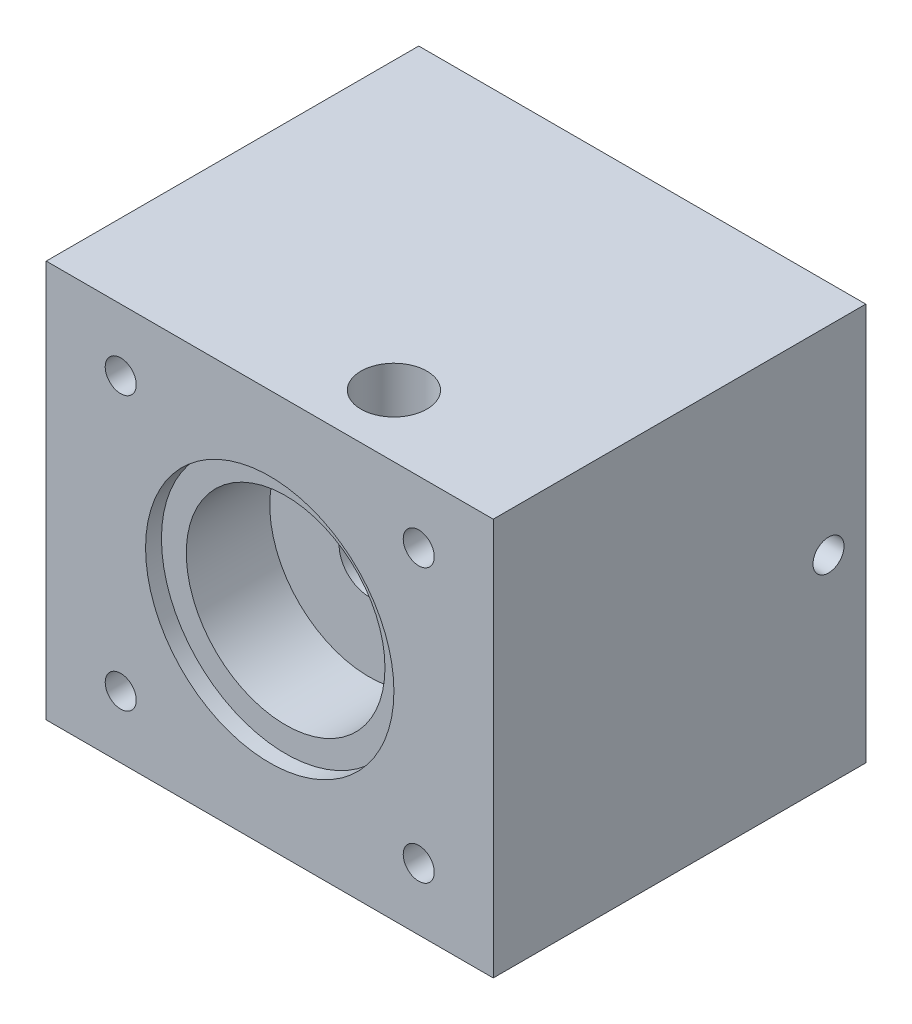
ISO-10303-21;
HEADER;
FILE_DESCRIPTION(('STEP AP214'),'2;1');
FILE_NAME('part.step','',(''),(''),'','','');
FILE_SCHEMA(('AUTOMOTIVE_DESIGN { 1 0 10303 214 1 1 1 1 }'));
ENDSEC;
DATA;
#1=APPLICATION_CONTEXT('core data for automotive mechanical design processes');
#2=APPLICATION_PROTOCOL_DEFINITION('international standard','automotive_design',2000,#1);
#3=PRODUCT_CONTEXT('',#1,'mechanical');
#4=PRODUCT('Part','Part','',(#3));
#5=PRODUCT_RELATED_PRODUCT_CATEGORY('part','',(#4));
#6=PRODUCT_DEFINITION_FORMATION('','',#4);
#7=PRODUCT_DEFINITION_CONTEXT('part definition',#1,'design');
#8=PRODUCT_DEFINITION('design','',#6,#7);
#9=PRODUCT_DEFINITION_SHAPE('','',#8);
#10=(LENGTH_UNIT() NAMED_UNIT(*) SI_UNIT(.MILLI.,.METRE.));
#11=(NAMED_UNIT(*) PLANE_ANGLE_UNIT() SI_UNIT($,.RADIAN.));
#12=(NAMED_UNIT(*) SI_UNIT($,.STERADIAN.) SOLID_ANGLE_UNIT());
#13=UNCERTAINTY_MEASURE_WITH_UNIT(LENGTH_MEASURE(1.E-05),#10,'distance_accuracy_value','');
#14=(GEOMETRIC_REPRESENTATION_CONTEXT(3) GLOBAL_UNCERTAINTY_ASSIGNED_CONTEXT((#13)) GLOBAL_UNIT_ASSIGNED_CONTEXT((#10,
#11,#12)) REPRESENTATION_CONTEXT('',''));
#15=CARTESIAN_POINT('',(0.,0.,0.));
#16=DIRECTION('',(0.,0.,1.));
#17=DIRECTION('',(1.,0.,0.));
#18=AXIS2_PLACEMENT_3D('',#15,#16,#17);
#19=CARTESIAN_POINT('',(47.625,25.4,6.35));
#20=DIRECTION('',(0.,0.,-1.));
#21=DIRECTION('',(-1.,0.,0.));
#22=AXIS2_PLACEMENT_3D('',#19,#20,#21);
#23=CYLINDRICAL_SURFACE('',#22,1.98501);
#24=CARTESIAN_POINT('',(47.625,25.4,0.));
#25=DIRECTION('',(0.,0.,-1.));
#26=DIRECTION('',(-1.,0.,0.));
#27=AXIS2_PLACEMENT_3D('',#24,#25,#26);
#28=CIRCLE('',#27,1.98501);
#29=CARTESIAN_POINT('',(45.63999,25.4,0.));
#30=VERTEX_POINT('',#29);
#31=EDGE_CURVE('E201',#30,#30,#28,.T.);
#32=ORIENTED_EDGE('',*,*,#31,.T.);
#33=EDGE_LOOP('',(#32));
#34=FACE_BOUND('',#33,.T.);
#35=DIRECTION('',(0.,0.,-1.));
#36=VECTOR('',#35,1.);
#37=CARTESIAN_POINT('',(46.0375,24.2083169674364,6.35));
#38=LINE('',#37,#36);
#39=CARTESIAN_POINT('',(46.0375,24.2083169674364,3.175));
#40=VERTEX_POINT('',#39);
#41=CARTESIAN_POINT('',(46.0375,24.2083169674364,6.35));
#42=VERTEX_POINT('',#41);
#43=EDGE_CURVE('E54',#40,#42,#38,.F.);
#44=ORIENTED_EDGE('',*,*,#43,.F.);
#45=CARTESIAN_POINT('',(47.625,25.4,4.7625));
#46=DIRECTION('',(0.707106781186547,0.,-0.707106781186547));
#47=DIRECTION('',(-0.707106781186547,0.,-0.707106781186547));
#48=AXIS2_PLACEMENT_3D('',#45,#46,#47);
#49=ELLIPSE('',#48,2.80722806344622,1.98501);
#50=CARTESIAN_POINT('',(47.625,23.41499,4.7625));
#51=VERTEX_POINT('',#50);
#52=EDGE_CURVE('E122',#40,#51,#49,.F.);
#53=ORIENTED_EDGE('',*,*,#52,.T.);
#54=CARTESIAN_POINT('',(47.625,25.4,4.7625));
#55=DIRECTION('',(-0.707106781186547,0.,-0.707106781186547));
#56=DIRECTION('',(0.707106781186547,0.,-0.707106781186547));
#57=AXIS2_PLACEMENT_3D('',#54,#55,#56);
#58=ELLIPSE('',#57,2.80722806344622,1.98501);
#59=CARTESIAN_POINT('',(47.625,27.38501,4.7625));
#60=VERTEX_POINT('',#59);
#61=EDGE_CURVE('E150',#51,#60,#58,.F.);
#62=ORIENTED_EDGE('',*,*,#61,.T.);
#63=CARTESIAN_POINT('',(46.0375,26.5916830325636,3.175));
#64=VERTEX_POINT('',#63);
#65=EDGE_CURVE('E134',#60,#64,#49,.F.);
#66=ORIENTED_EDGE('',*,*,#65,.T.);
#67=DIRECTION('',(0.,0.,-1.));
#68=VECTOR('',#67,1.);
#69=CARTESIAN_POINT('',(46.0375,26.5916830325636,6.35));
#70=LINE('',#69,#68);
#71=CARTESIAN_POINT('',(46.0375,26.5916830325636,6.35));
#72=VERTEX_POINT('',#71);
#73=EDGE_CURVE('E143',#72,#64,#70,.T.);
#74=ORIENTED_EDGE('',*,*,#73,.F.);
#75=CARTESIAN_POINT('',(47.625,25.4,6.35));
#76=DIRECTION('',(0.,0.,-1.));
#77=DIRECTION('',(-1.,0.,0.));
#78=AXIS2_PLACEMENT_3D('',#75,#76,#77);
#79=CIRCLE('',#78,1.98501);
#80=EDGE_CURVE('E141',#42,#72,#79,.T.);
#81=ORIENTED_EDGE('',*,*,#80,.F.);
#82=EDGE_LOOP('',(#44,#53,#62,#66,#74,#81));
#83=FACE_BOUND('',#82,.T.);
#84=ADVANCED_FACE('F33',(#34,#83),#23,.F.);
#85=CARTESIAN_POINT('',(47.625,25.4,6.35));
#86=DIRECTION('',(0.,0.,-1.));
#87=DIRECTION('',(-1.,0.,0.));
#88=AXIS2_PLACEMENT_3D('',#85,#86,#87);
#89=PLANE('',#88);
#90=ORIENTED_EDGE('',*,*,#80,.T.);
#91=DIRECTION('',(0.,-1.,0.));
#92=VECTOR('',#91,1.);
#93=CARTESIAN_POINT('',(46.0375,25.4,6.35));
#94=LINE('',#93,#92);
#95=EDGE_CURVE('E314',#72,#42,#94,.T.);
#96=ORIENTED_EDGE('',*,*,#95,.T.);
#97=EDGE_LOOP('',(#90,#96));
#98=FACE_BOUND('',#97,.T.);
#99=ADVANCED_FACE('F272',(#98),#89,.T.);
#100=CARTESIAN_POINT('',(9.525,25.4,6.35));
#101=DIRECTION('',(0.,0.,-1.));
#102=DIRECTION('',(-1.,0.,0.));
#103=AXIS2_PLACEMENT_3D('',#100,#101,#102);
#104=CYLINDRICAL_SURFACE('',#103,1.98501);
#105=CARTESIAN_POINT('',(9.525,25.4,0.));
#106=DIRECTION('',(0.,0.,-1.));
#107=DIRECTION('',(-1.,0.,0.));
#108=AXIS2_PLACEMENT_3D('',#105,#106,#107);
#109=CIRCLE('',#108,1.98501);
#110=CARTESIAN_POINT('',(7.53999,25.4,0.));
#111=VERTEX_POINT('',#110);
#112=EDGE_CURVE('E210',#111,#111,#109,.T.);
#113=ORIENTED_EDGE('',*,*,#112,.T.);
#114=EDGE_LOOP('',(#113));
#115=FACE_BOUND('',#114,.T.);
#116=DIRECTION('',(0.,0.,-1.));
#117=VECTOR('',#116,1.);
#118=CARTESIAN_POINT('',(11.1125,26.5916830325636,6.35));
#119=LINE('',#118,#117);
#120=CARTESIAN_POINT('',(11.1125,26.5916830325636,3.175));
#121=VERTEX_POINT('',#120);
#122=CARTESIAN_POINT('',(11.1125,26.5916830325636,6.35));
#123=VERTEX_POINT('',#122);
#124=EDGE_CURVE('E162',#121,#123,#119,.F.);
#125=ORIENTED_EDGE('',*,*,#124,.F.);
#126=CARTESIAN_POINT('',(9.525,25.4,4.7625));
#127=DIRECTION('',(-0.707106781186547,0.,-0.707106781186547));
#128=DIRECTION('',(0.707106781186547,0.,-0.707106781186547));
#129=AXIS2_PLACEMENT_3D('',#126,#127,#128);
#130=ELLIPSE('',#129,2.80722806344622,1.98501);
#131=CARTESIAN_POINT('',(9.525,27.38501,4.7625));
#132=VERTEX_POINT('',#131);
#133=EDGE_CURVE('E171',#121,#132,#130,.F.);
#134=ORIENTED_EDGE('',*,*,#133,.T.);
#135=CARTESIAN_POINT('',(9.525,25.4,4.7625));
#136=DIRECTION('',(0.707106781186547,0.,-0.707106781186547));
#137=DIRECTION('',(-0.707106781186547,0.,-0.707106781186547));
#138=AXIS2_PLACEMENT_3D('',#135,#136,#137);
#139=ELLIPSE('',#138,2.80722806344622,1.98501);
#140=CARTESIAN_POINT('',(9.525,23.41499,4.7625));
#141=VERTEX_POINT('',#140);
#142=EDGE_CURVE('E176',#132,#141,#139,.F.);
#143=ORIENTED_EDGE('',*,*,#142,.T.);
#144=CARTESIAN_POINT('',(11.1125,24.2083169674364,3.175));
#145=VERTEX_POINT('',#144);
#146=EDGE_CURVE('E175',#141,#145,#130,.F.);
#147=ORIENTED_EDGE('',*,*,#146,.T.);
#148=DIRECTION('',(0.,0.,-1.));
#149=VECTOR('',#148,1.);
#150=CARTESIAN_POINT('',(11.1125,24.2083169674364,6.35));
#151=LINE('',#150,#149);
#152=CARTESIAN_POINT('',(11.1125,24.2083169674364,6.35));
#153=VERTEX_POINT('',#152);
#154=EDGE_CURVE('E156',#153,#145,#151,.T.);
#155=ORIENTED_EDGE('',*,*,#154,.F.);
#156=CARTESIAN_POINT('',(9.525,25.4,6.35));
#157=DIRECTION('',(0.,0.,-1.));
#158=DIRECTION('',(-1.,0.,0.));
#159=AXIS2_PLACEMENT_3D('',#156,#157,#158);
#160=CIRCLE('',#159,1.98501);
#161=EDGE_CURVE('E208',#123,#153,#160,.T.);
#162=ORIENTED_EDGE('',*,*,#161,.F.);
#163=EDGE_LOOP('',(#125,#134,#143,#147,#155,#162));
#164=FACE_BOUND('',#163,.T.);
#165=ADVANCED_FACE('F280',(#115,#164),#104,.F.);
#166=CARTESIAN_POINT('',(9.525,25.4,6.35));
#167=DIRECTION('',(0.,0.,-1.));
#168=DIRECTION('',(-1.,0.,0.));
#169=AXIS2_PLACEMENT_3D('',#166,#167,#168);
#170=PLANE('',#169);
#171=ORIENTED_EDGE('',*,*,#161,.T.);
#172=DIRECTION('',(0.,1.,0.));
#173=VECTOR('',#172,1.);
#174=CARTESIAN_POINT('',(11.1125,25.4,6.35));
#175=LINE('',#174,#173);
#176=EDGE_CURVE('E326',#153,#123,#175,.T.);
#177=ORIENTED_EDGE('',*,*,#176,.T.);
#178=EDGE_LOOP('',(#171,#177));
#179=FACE_BOUND('',#178,.T.);
#180=ADVANCED_FACE('F385',(#179),#170,.T.);
#181=CARTESIAN_POINT('',(28.575,25.4,0.));
#182=DIRECTION('',(0.,0.,1.));
#183=DIRECTION('',(1.,0.,0.));
#184=AXIS2_PLACEMENT_3D('',#181,#182,#183);
#185=CYLINDRICAL_SURFACE('',#184,3.8354);
#186=CARTESIAN_POINT('',(28.575,25.4,34.925));
#187=DIRECTION('',(0.,0.,1.));
#188=DIRECTION('',(1.,0.,0.));
#189=AXIS2_PLACEMENT_3D('',#186,#187,#188);
#190=CIRCLE('',#189,3.8354);
#191=CARTESIAN_POINT('',(32.4104,25.4,34.925));
#192=VERTEX_POINT('',#191);
#193=EDGE_CURVE('E336',#192,#192,#190,.F.);
#194=ORIENTED_EDGE('',*,*,#193,.F.);
#195=EDGE_LOOP('',(#194));
#196=FACE_BOUND('',#195,.T.);
#197=CARTESIAN_POINT('',(28.575,25.4,2.794));
#198=DIRECTION('',(0.,0.,-1.));
#199=DIRECTION('',(-1.,0.,0.));
#200=AXIS2_PLACEMENT_3D('',#197,#198,#199);
#201=CIRCLE('',#200,3.8354);
#202=CARTESIAN_POINT('',(24.7396,25.4,2.794));
#203=VERTEX_POINT('',#202);
#204=EDGE_CURVE('E222',#203,#203,#201,.F.);
#205=ORIENTED_EDGE('',*,*,#204,.F.);
#206=EDGE_LOOP('',(#205));
#207=FACE_BOUND('',#206,.T.);
#208=ADVANCED_FACE('F377',(#196,#207),#185,.F.);
#209=CARTESIAN_POINT('',(28.575,25.4,34.925));
#210=DIRECTION('',(0.,0.,1.));
#211=DIRECTION('',(1.,0.,0.));
#212=AXIS2_PLACEMENT_3D('',#209,#210,#211);
#213=CYLINDRICAL_SURFACE('',#212,12.7);
#214=CARTESIAN_POINT('',(36.5125,35.3139343224575,43.9039));
#215=CARTESIAN_POINT('',(36.6516280292797,35.2025417451199,43.903900216119));
#216=CARTESIAN_POINT('',(36.7884335575704,35.0881932089361,43.8970134166104));
#217=CARTESIAN_POINT('',(37.0564839618486,34.8544223142145,43.8708318174462));
#218=CARTESIAN_POINT('',(37.1877251363861,34.7349966809268,43.8515288923607));
#219=CARTESIAN_POINT('',(37.4444079135831,34.4914794970766,43.801710013297));
#220=CARTESIAN_POINT('',(37.5698288140301,34.3673737714213,43.7711570430975));
#221=CARTESIAN_POINT('',(37.8140013520869,34.1155964957841,43.7000171205012));
#222=CARTESIAN_POINT('',(37.9327534774568,33.987925207616,43.6594309031211));
#223=CARTESIAN_POINT('',(38.2153553843962,33.6714317843791,43.5489224861815));
#224=CARTESIAN_POINT('',(38.3754321929643,33.4809622714377,43.4740200894582));
#225=CARTESIAN_POINT('',(38.6809579166009,33.0954642206641,43.3077342367703));
#226=CARTESIAN_POINT('',(38.826398865194,32.9004332704012,43.2163418799004));
#227=CARTESIAN_POINT('',(39.1027270122318,32.5073703903988,43.0188086455895));
#228=CARTESIAN_POINT('',(39.2336046235855,32.3093365801831,42.9126581550273));
#229=CARTESIAN_POINT('',(39.4808179090983,31.9121268599586,42.686696194221));
#230=CARTESIAN_POINT('',(39.597159806597,31.7129514771693,42.5668906125893));
#231=CARTESIAN_POINT('',(39.7730564691428,31.3927267921,42.3628003725987));
#232=CARTESIAN_POINT('',(39.8371130738036,31.2713879909421,42.2827987331947));
#233=CARTESIAN_POINT('',(39.9598564826955,31.0296889115665,42.1173922257172));
#234=CARTESIAN_POINT('',(40.0185440078874,30.9093285039536,42.031988085705));
#235=CARTESIAN_POINT('',(40.1303508240528,30.6707845124965,41.8554656057517));
#236=CARTESIAN_POINT('',(40.1834847233439,30.5525959280981,41.7643633190012));
#237=CARTESIAN_POINT('',(40.2842006357529,30.3194222173144,41.5752993997106));
#238=CARTESIAN_POINT('',(40.3317851429677,30.2044356696445,41.4773408805318));
#239=CARTESIAN_POINT('',(40.4156779709564,29.9934336260044,41.285263116512));
#240=CARTESIAN_POINT('',(40.4526540186308,29.8968064044417,41.1921140989876));
#241=CARTESIAN_POINT('',(40.521651364214,29.7101495365032,40.9972525918994));
#242=CARTESIAN_POINT('',(40.5536655016631,29.6201295216489,40.8955280477802));
#243=CARTESIAN_POINT('',(40.6073202066154,29.4643584296364,40.697156502899));
#244=CARTESIAN_POINT('',(40.6297962744492,29.3969917057496,40.6020295852183));
#245=CARTESIAN_POINT('',(40.669134820026,29.2763257115478,40.4021360268526));
#246=CARTESIAN_POINT('',(40.6860177857001,29.2229752507717,40.2974064035603));
#247=CARTESIAN_POINT('',(40.7073148043534,29.1546934605108,40.1191519854232));
#248=CARTESIAN_POINT('',(40.7140307234782,29.1328556889138,40.0486014195256));
#249=CARTESIAN_POINT('',(40.7239150314796,29.1005614916139,39.9047234373582));
#250=CARTESIAN_POINT('',(40.7270896818643,29.0900849783737,39.8314011600789));
#251=CARTESIAN_POINT('',(40.7295481156763,29.0819811531365,39.6835986243642));
#252=CARTESIAN_POINT('',(40.7288131492894,29.0844157603649,39.6091144969057));
#253=CARTESIAN_POINT('',(40.7235011020894,29.101890623878,39.461763162896));
#254=CARTESIAN_POINT('',(40.7189192613793,29.1169464969422,39.3888980743548));
#255=CARTESIAN_POINT('',(40.7044393668785,29.1639689975235,39.2244015711825));
#256=CARTESIAN_POINT('',(40.6933300593205,29.1997419294353,39.1339929760712));
#257=CARTESIAN_POINT('',(40.6666038742856,29.2839485152508,38.959994732195));
#258=CARTESIAN_POINT('',(40.6509735749089,29.3324198270485,38.8764263525769));
#259=CARTESIAN_POINT('',(40.6164834328254,29.4367876655952,38.7169955379318));
#260=CARTESIAN_POINT('',(40.5976826478644,29.492544827845,38.6410267218405));
#261=CARTESIAN_POINT('',(40.557226742838,29.6095226952861,38.4941766032984));
#262=CARTESIAN_POINT('',(40.5355686531711,29.6707490629562,38.4233007139618));
#263=CARTESIAN_POINT('',(40.4897076601234,29.7970754052366,38.2856732615415));
#264=CARTESIAN_POINT('',(40.4654987837041,29.8621843095195,38.2189319872286));
#265=CARTESIAN_POINT('',(40.4147837164516,29.9950609932965,38.0890413274218));
#266=CARTESIAN_POINT('',(40.3882766872333,30.062829738146,38.0258932667947));
#267=CARTESIAN_POINT('',(40.3273545719437,30.2145781117548,37.8898429428732));
#268=CARTESIAN_POINT('',(40.2924426338466,30.2989929618863,37.817650311125));
#269=CARTESIAN_POINT('',(40.2195999864084,30.4697062824488,37.6771037372212));
#270=CARTESIAN_POINT('',(40.1816685696883,30.5560051908047,37.6087507010097));
#271=CARTESIAN_POINT('',(40.0634016398084,30.8169223719503,37.4086378565292));
#272=CARTESIAN_POINT('',(39.9786422875604,30.9934380968967,37.281931278089));
#273=CARTESIAN_POINT('',(39.7974563291191,31.3486441127071,37.0398733768858));
#274=CARTESIAN_POINT('',(39.7010119926956,31.5273373285824,36.9245398043098));
#275=CARTESIAN_POINT('',(39.496552616868,31.8847558679295,36.7048912942663));
#276=CARTESIAN_POINT('',(39.3885423798794,32.0634811475493,36.6005718189635));
#277=CARTESIAN_POINT('',(39.1475872387881,32.4403162025411,36.3916488769533));
#278=CARTESIAN_POINT('',(39.013203295277,32.6382703440604,36.2884154403964));
#279=CARTESIAN_POINT('',(38.7296309838936,33.0309991862636,36.0970097826879));
#280=CARTESIAN_POINT('',(38.5804375198685,33.2257727654372,36.0088427746967));
#281=CARTESIAN_POINT('',(38.2677255996594,33.6098865652802,35.8498057275719));
#282=CARTESIAN_POINT('',(38.1042487410666,33.7992405632951,35.7788875958791));
#283=CARTESIAN_POINT('',(37.7629907451034,34.1712267030886,35.6567301489407));
#284=CARTESIAN_POINT('',(37.5852193980655,34.353863322757,35.6054775012965));
#285=CARTESIAN_POINT('',(37.2847787009618,34.644231998832,35.540731275501));
#286=CARTESIAN_POINT('',(37.1661357462776,34.7546148796222,35.520283550394));
#287=CARTESIAN_POINT('',(36.9239826945106,34.971356356394,35.489452643209));
#288=CARTESIAN_POINT('',(36.8004739867477,35.0777160843481,35.4790666095796));
#289=CARTESIAN_POINT('',(36.5492788512389,35.2857194013401,35.4693889357973));
#290=CARTESIAN_POINT('',(36.4215960171114,35.3873668739754,35.4700879907907));
#291=CARTESIAN_POINT('',(36.1628016273912,35.5853713971943,35.4836303129242));
#292=CARTESIAN_POINT('',(36.0316905917018,35.681729243184,35.4964717488815));
#293=CARTESIAN_POINT('',(35.7895077401517,35.8527029971414,35.5320627855703));
#294=CARTESIAN_POINT('',(35.6787881187629,35.9282438184365,35.5527745734162));
#295=CARTESIAN_POINT('',(35.4565950401765,36.0747997815191,35.6038640304821));
#296=CARTESIAN_POINT('',(35.3451217381853,36.1458158254793,35.6342397655717));
#297=CARTESIAN_POINT('',(35.1223651587741,36.2829738482305,35.7051368878799));
#298=CARTESIAN_POINT('',(35.0110819072578,36.3491152074877,35.7456595618259));
#299=CARTESIAN_POINT('',(34.7899025172475,36.4761564842906,35.8371751796783));
#300=CARTESIAN_POINT('',(34.6800057092189,36.5370590214353,35.8881628470135));
#301=CARTESIAN_POINT('',(34.4619871979524,36.6538343721772,36.001226118655));
#302=CARTESIAN_POINT('',(34.3538848954616,36.7096662007686,36.0633817299956));
#303=CARTESIAN_POINT('',(34.141738655687,36.8155802498037,36.1984709475547));
#304=CARTESIAN_POINT('',(34.0376928575533,36.8656651275461,36.2713995365474));
#305=CARTESIAN_POINT('',(33.8350440852495,36.9600360008626,36.4278007937771));
#306=CARTESIAN_POINT('',(33.736440616976,37.0043225233659,36.5112725025449));
#307=CARTESIAN_POINT('',(33.5460895555223,37.0871315382786,36.6882796495823));
#308=CARTESIAN_POINT('',(33.4543410924513,37.1256547626665,36.7818138072531));
#309=CARTESIAN_POINT('',(33.2895949633974,37.1927745802662,36.9664108566707));
#310=CARTESIAN_POINT('',(33.2156694106689,37.2220078439681,37.0564171531216));
#311=CARTESIAN_POINT('',(33.0749999158131,37.2762656009115,37.2430625562811));
#312=CARTESIAN_POINT('',(33.0082554177487,37.3012904200438,37.3397011485857));
#313=CARTESIAN_POINT('',(32.8827136969183,37.3473040654859,37.5388870411854));
#314=CARTESIAN_POINT('',(32.8239147263029,37.368293779865,37.6414330348736));
#315=CARTESIAN_POINT('',(32.714897849552,37.4064392440577,37.8516713340458));
#316=CARTESIAN_POINT('',(32.6646798184165,37.4235950497216,37.9593635645345));
#317=CARTESIAN_POINT('',(32.5756713723503,37.4534941315025,38.1735083622554));
#318=CARTESIAN_POINT('',(32.5364326754282,37.4664161750814,38.2797500161551));
#319=CARTESIAN_POINT('',(32.4665454768009,37.4891366884586,38.4953881962008));
#320=CARTESIAN_POINT('',(32.4358998306687,37.4989341200594,38.6047857578047));
#321=CARTESIAN_POINT('',(32.3835152379402,37.5155258692787,38.8258655657066));
#322=CARTESIAN_POINT('',(32.3617724714165,37.522321474979,38.937546810511));
#323=CARTESIAN_POINT('',(32.3273678633033,37.5330153195431,39.1624788829047));
#324=CARTESIAN_POINT('',(32.3147093788445,37.5369124872975,39.2757302750043));
#325=CARTESIAN_POINT('',(32.2986488103976,37.5418495186437,39.5022786587906));
#326=CARTESIAN_POINT('',(32.2951927072028,37.5429060574655,39.6155714623306));
#327=CARTESIAN_POINT('',(32.2974125498334,37.5422257517196,39.8421010268997));
#328=CARTESIAN_POINT('',(32.3030918484061,37.5404878815874,39.9553377520895));
#329=CARTESIAN_POINT('',(32.3235343038471,37.5341915485419,40.1808669216259));
#330=CARTESIAN_POINT('',(32.338294098556,37.529634129596,40.2931596998879));
#331=CARTESIAN_POINT('',(32.3767688896967,37.5176300869064,40.516086688437));
#332=CARTESIAN_POINT('',(32.4004871831721,37.5101823994142,40.626720272477));
#333=CARTESIAN_POINT('',(32.4566631122776,37.4922933897126,40.8455033788965));
#334=CARTESIAN_POINT('',(32.4891210877791,37.4818519510803,40.9536528044938));
#335=CARTESIAN_POINT('',(32.5624874834829,37.4578369861771,41.1667333187739));
#336=CARTESIAN_POINT('',(32.6033990046338,37.4442623103505,41.2716632101923));
#337=CARTESIAN_POINT('',(32.6932566124252,37.4138340889848,41.4774750415785));
#338=CARTESIAN_POINT('',(32.7421991141611,37.3969820058103,41.5783587628024));
#339=CARTESIAN_POINT('',(32.8476732048711,37.3598240258848,41.7754591786119));
#340=CARTESIAN_POINT('',(32.9042075723365,37.3395168639048,41.8716741468808));
#341=CARTESIAN_POINT('',(33.0242711936005,37.2952961322718,42.0587075301506));
#342=CARTESIAN_POINT('',(33.0877973249669,37.2713841707263,42.1495283264434));
#343=CARTESIAN_POINT('',(33.2212200405322,37.2198040837601,42.3252455029314));
#344=CARTESIAN_POINT('',(33.2911189247586,37.1921346004124,42.410139724457));
#345=CARTESIAN_POINT('',(33.5092691160816,37.103313288391,42.6550367705017));
#346=CARTESIAN_POINT('',(33.666115265701,37.0362983496885,42.8054718299366));
#347=CARTESIAN_POINT('',(33.9988000422097,36.8850459757278,43.0796451406653));
#348=CARTESIAN_POINT('',(34.1749059741952,36.8005462686809,43.2029096296674));
#349=CARTESIAN_POINT('',(34.537234644099,36.6153088852494,43.4185626034665));
#350=CARTESIAN_POINT('',(34.7234624292525,36.5145630576082,43.5109355169709));
#351=CARTESIAN_POINT('',(35.1130544033728,36.2902666489104,43.6708505493183));
#352=CARTESIAN_POINT('',(35.3166903703547,36.1655993052855,43.7361393106794));
#353=CARTESIAN_POINT('',(35.7216380041273,35.9011431576919,43.8343015977017));
#354=CARTESIAN_POINT('',(35.9229511360437,35.7613645355274,43.8671968005539));
#355=CARTESIAN_POINT('',(36.1868536211121,35.5664402709638,43.8918324803748));
#356=CARTESIAN_POINT('',(36.2526349738597,35.5168536809217,43.8963930907255));
#357=CARTESIAN_POINT('',(36.3832762117168,35.4163664979118,43.9024258617216));
#358=CARTESIAN_POINT('',(36.4481366331874,35.3654667228839,43.9038999000191));
#359=CARTESIAN_POINT('',(36.5125,35.3139343224575,43.9039));
#360=B_SPLINE_CURVE_WITH_KNOTS('',3,(#214,#215,#216,#217,#218,#219,#220,#221,#222,#223,#224,
#225,#226,#227,#228,#229,#230,#231,#232,#233,#234,#235,#236,#237,#238,#239,#240,#241,#242,#243,
#244,#245,#246,#247,#248,#249,#250,#251,#252,#253,#254,#255,#256,#257,#258,#259,#260,#261,#262,
#263,#264,#265,#266,#267,#268,#269,#270,#271,#272,#273,#274,#275,#276,#277,#278,#279,#280,#281,
#282,#283,#284,#285,#286,#287,#288,#289,#290,#291,#292,#293,#294,#295,#296,#297,#298,#299,#300,
#301,#302,#303,#304,#305,#306,#307,#308,#309,#310,#311,#312,#313,#314,#315,#316,#317,#318,#319,
#320,#321,#322,#323,#324,#325,#326,#327,#328,#329,#330,#331,#332,#333,#334,#335,#336,#337,#338,
#339,#340,#341,#342,#343,#344,#345,#346,#347,#348,#349,#350,#351,#352,#353,#354,#355,#356,#357,
#358,#359),.UNSPECIFIED.,.T.,.F.,(4,2,2,2,2,2,2,2,2,2,2,2,2,2,2,2,2,2,2,2,2,2,2,2,2,2,2,2,2,2,2,
2,2,2,2,2,2,2,2,2,2,2,2,2,2,2,2,2,2,2,2,2,2,2,2,2,2,2,2,2,2,2,2,2,2,2,2,2,2,2,2,2,4),(0.,
0.534598788010329,1.06954778757262,1.6062729012978,2.14295870720543,2.92132340220757,
3.70010950454983,4.47940528854249,5.2583662720696,5.73469588474094,6.21096144164,
6.68594090765666,7.16070607130634,7.57801105837676,7.99591275489937,8.35124575638996,
8.70526237245001,8.92690927343523,9.14816364429593,9.37048006484701,9.59307197280898,
9.88498676789456,10.1777772530561,10.46561846535,10.7537612234802,11.0425943716319,
11.3315333354575,11.6806845934456,12.0299178898383,12.7288934271557,13.4289431608115,
14.1287033374001,14.9096137577094,15.6907938374219,16.4697702338526,17.248217578877,
17.7378547735369,18.2273531610702,18.7164406840835,19.2054544599563,19.6119426932115,
20.0183496235469,20.4248081162366,20.8310621690885,21.2403519351887,21.6494516830201,
22.058514227808,22.4675247746483,22.8273261704407,23.1870996913347,23.5467939403012,
23.9064829490908,24.2480497353069,24.58972989407,24.9312632953151,25.2729228466143,
25.6125723431587,25.9523465215459,26.2919949702362,26.6317685435291,26.9715553319439,
27.3114669836934,27.6512273148931,27.9911123331085,28.3308461742462,28.6707031198106,
29.349633397519,30.0396009113308,30.7299156896966,31.4696917783434,32.2089724849492,
32.4564389994397,32.7037549290074),.UNSPECIFIED.);
#361=CARTESIAN_POINT('',(36.5125,35.3139343224575,43.9039));
#362=VERTEX_POINT('',#361);
#363=EDGE_CURVE('E228',#362,#362,#360,.T.);
#364=ORIENTED_EDGE('',*,*,#363,.T.);
#365=EDGE_LOOP('',(#364));
#366=FACE_BOUND('',#365,.T.);
#367=CARTESIAN_POINT('',(28.575,25.4,34.925));
#368=DIRECTION('',(0.,0.,1.));
#369=DIRECTION('',(1.,0.,0.));
#370=AXIS2_PLACEMENT_3D('',#367,#368,#369);
#371=CIRCLE('',#370,12.7);
#372=CARTESIAN_POINT('',(41.275,25.4,34.925));
#373=VERTEX_POINT('',#372);
#374=EDGE_CURVE('E335',#373,#373,#371,.T.);
#375=ORIENTED_EDGE('',*,*,#374,.F.);
#376=EDGE_LOOP('',(#375));
#377=FACE_BOUND('',#376,.T.);
#378=CARTESIAN_POINT('',(28.575,25.4,45.593));
#379=DIRECTION('',(0.,0.,1.));
#380=DIRECTION('',(1.,0.,0.));
#381=AXIS2_PLACEMENT_3D('',#378,#379,#380);
#382=CIRCLE('',#381,12.7);
#383=CARTESIAN_POINT('',(41.275,25.4,45.593));
#384=VERTEX_POINT('',#383);
#385=EDGE_CURVE('E332',#384,#384,#382,.F.);
#386=ORIENTED_EDGE('',*,*,#385,.F.);
#387=EDGE_LOOP('',(#386));
#388=FACE_BOUND('',#387,.T.);
#389=ADVANCED_FACE('F239',(#366,#377,#388),#213,.F.);
#390=CARTESIAN_POINT('',(0.,0.,47.625));
#391=DIRECTION('',(1.,0.,0.));
#392=DIRECTION('',(0.,0.,-1.));
#393=AXIS2_PLACEMENT_3D('',#390,#391,#392);
#394=PLANE('',#393);
#395=CARTESIAN_POINT('',(0.,25.4,4.7625));
#396=DIRECTION('',(-1.,0.,0.));
#397=DIRECTION('',(0.,0.,1.));
#398=AXIS2_PLACEMENT_3D('',#395,#396,#397);
#399=CIRCLE('',#398,1.98501);
#400=CARTESIAN_POINT('',(0.,25.4,6.74751000000001));
#401=VERTEX_POINT('',#400);
#402=EDGE_CURVE('E152',#401,#401,#399,.T.);
#403=ORIENTED_EDGE('',*,*,#402,.F.);
#404=EDGE_LOOP('',(#403));
#405=FACE_BOUND('',#404,.T.);
#406=DIRECTION('',(0.,-1.,0.));
#407=VECTOR('',#406,1.);
#408=CARTESIAN_POINT('',(0.,0.,0.));
#409=LINE('',#408,#407);
#410=CARTESIAN_POINT('',(0.,50.8,0.));
#411=VERTEX_POINT('',#410);
#412=CARTESIAN_POINT('',(0.,0.,0.));
#413=VERTEX_POINT('',#412);
#414=EDGE_CURVE('E339',#411,#413,#409,.T.);
#415=ORIENTED_EDGE('',*,*,#414,.T.);
#416=DIRECTION('',(0.,0.,-1.));
#417=VECTOR('',#416,1.);
#418=CARTESIAN_POINT('',(0.,0.,47.625));
#419=LINE('',#418,#417);
#420=CARTESIAN_POINT('',(0.,0.,47.625));
#421=VERTEX_POINT('',#420);
#422=EDGE_CURVE('E329',#421,#413,#419,.T.);
#423=ORIENTED_EDGE('',*,*,#422,.F.);
#424=DIRECTION('',(0.,-1.,0.));
#425=VECTOR('',#424,1.);
#426=CARTESIAN_POINT('',(0.,0.,47.625));
#427=LINE('',#426,#425);
#428=CARTESIAN_POINT('',(0.,50.8,47.625));
#429=VERTEX_POINT('',#428);
#430=EDGE_CURVE('E354',#429,#421,#427,.T.);
#431=ORIENTED_EDGE('',*,*,#430,.F.);
#432=DIRECTION('',(0.,0.,-1.));
#433=VECTOR('',#432,1.);
#434=CARTESIAN_POINT('',(0.,50.8,47.625));
#435=LINE('',#434,#433);
#436=EDGE_CURVE('E348',#429,#411,#435,.T.);
#437=ORIENTED_EDGE('',*,*,#436,.T.);
#438=EDGE_LOOP('',(#415,#423,#431,#437));
#439=FACE_BOUND('',#438,.T.);
#440=ADVANCED_FACE('F35',(#405,#439),#394,.F.);
#441=CARTESIAN_POINT('',(0.,0.,47.625));
#442=DIRECTION('',(0.,1.,0.));
#443=DIRECTION('',(0.,0.,1.));
#444=AXIS2_PLACEMENT_3D('',#441,#442,#443);
#445=PLANE('',#444);
#446=DIRECTION('',(1.,0.,0.));
#447=VECTOR('',#446,1.);
#448=CARTESIAN_POINT('',(0.,0.,0.));
#449=LINE('',#448,#447);
#450=CARTESIAN_POINT('',(57.15,0.,0.));
#451=VERTEX_POINT('',#450);
#452=EDGE_CURVE('E357',#413,#451,#449,.T.);
#453=ORIENTED_EDGE('',*,*,#452,.T.);
#454=DIRECTION('',(0.,0.,-1.));
#455=VECTOR('',#454,1.);
#456=CARTESIAN_POINT('',(57.15,0.,47.625));
#457=LINE('',#456,#455);
#458=CARTESIAN_POINT('',(57.15,0.,47.625));
#459=VERTEX_POINT('',#458);
#460=EDGE_CURVE('E342',#459,#451,#457,.T.);
#461=ORIENTED_EDGE('',*,*,#460,.F.);
#462=DIRECTION('',(1.,0.,0.));
#463=VECTOR('',#462,1.);
#464=CARTESIAN_POINT('',(0.,0.,47.625));
#465=LINE('',#464,#463);
#466=EDGE_CURVE('E364',#421,#459,#465,.T.);
#467=ORIENTED_EDGE('',*,*,#466,.F.);
#468=ORIENTED_EDGE('',*,*,#422,.T.);
#469=EDGE_LOOP('',(#453,#461,#467,#468));
#470=FACE_BOUND('',#469,.T.);
#471=ADVANCED_FACE('F383',(#470),#445,.F.);
#472=CARTESIAN_POINT('',(57.15,0.,47.625));
#473=DIRECTION('',(-1.,0.,0.));
#474=DIRECTION('',(0.,-1.,0.));
#475=AXIS2_PLACEMENT_3D('',#472,#473,#474);
#476=PLANE('',#475);
#477=CARTESIAN_POINT('',(57.15,25.4,4.7625));
#478=DIRECTION('',(1.,0.,0.));
#479=DIRECTION('',(0.,1.,0.));
#480=AXIS2_PLACEMENT_3D('',#477,#478,#479);
#481=CIRCLE('',#480,1.98501);
#482=CARTESIAN_POINT('',(57.15,27.38501,4.7625));
#483=VERTEX_POINT('',#482);
#484=EDGE_CURVE('E308',#483,#483,#481,.T.);
#485=ORIENTED_EDGE('',*,*,#484,.F.);
#486=EDGE_LOOP('',(#485));
#487=FACE_BOUND('',#486,.T.);
#488=DIRECTION('',(0.,1.,0.));
#489=VECTOR('',#488,1.);
#490=CARTESIAN_POINT('',(57.15,0.,0.));
#491=LINE('',#490,#489);
#492=CARTESIAN_POINT('',(57.15,50.8,0.));
#493=VERTEX_POINT('',#492);
#494=EDGE_CURVE('E355',#451,#493,#491,.T.);
#495=ORIENTED_EDGE('',*,*,#494,.T.);
#496=DIRECTION('',(0.,0.,-1.));
#497=VECTOR('',#496,1.);
#498=CARTESIAN_POINT('',(57.15,50.8,47.625));
#499=LINE('',#498,#497);
#500=CARTESIAN_POINT('',(57.15,50.8,47.625));
#501=VERTEX_POINT('',#500);
#502=EDGE_CURVE('E345',#501,#493,#499,.T.);
#503=ORIENTED_EDGE('',*,*,#502,.F.);
#504=DIRECTION('',(0.,1.,0.));
#505=VECTOR('',#504,1.);
#506=CARTESIAN_POINT('',(57.15,0.,47.625));
#507=LINE('',#506,#505);
#508=EDGE_CURVE('E362',#459,#501,#507,.T.);
#509=ORIENTED_EDGE('',*,*,#508,.F.);
#510=ORIENTED_EDGE('',*,*,#460,.T.);
#511=EDGE_LOOP('',(#495,#503,#509,#510));
#512=FACE_BOUND('',#511,.T.);
#513=ADVANCED_FACE('F407',(#487,#512),#476,.F.);
#514=CARTESIAN_POINT('',(0.,50.8,47.625));
#515=DIRECTION('',(0.,-1.,0.));
#516=DIRECTION('',(0.,0.,-1.));
#517=AXIS2_PLACEMENT_3D('',#514,#515,#516);
#518=PLANE('',#517);
#519=CARTESIAN_POINT('',(36.5125,50.8,39.6875));
#520=DIRECTION('',(0.,1.,0.));
#521=DIRECTION('',(0.,0.,1.));
#522=AXIS2_PLACEMENT_3D('',#519,#520,#521);
#523=CIRCLE('',#522,4.2164);
#524=CARTESIAN_POINT('',(36.5125,50.8,43.9039));
#525=VERTEX_POINT('',#524);
#526=EDGE_CURVE('E225',#525,#525,#523,.T.);
#527=ORIENTED_EDGE('',*,*,#526,.F.);
#528=EDGE_LOOP('',(#527));
#529=FACE_BOUND('',#528,.T.);
#530=DIRECTION('',(-1.,0.,0.));
#531=VECTOR('',#530,1.);
#532=CARTESIAN_POINT('',(0.,50.8,0.));
#533=LINE('',#532,#531);
#534=EDGE_CURVE('E352',#493,#411,#533,.T.);
#535=ORIENTED_EDGE('',*,*,#534,.T.);
#536=ORIENTED_EDGE('',*,*,#436,.F.);
#537=DIRECTION('',(-1.,0.,0.));
#538=VECTOR('',#537,1.);
#539=CARTESIAN_POINT('',(0.,50.8,47.625));
#540=LINE('',#539,#538);
#541=EDGE_CURVE('E351',#501,#429,#540,.T.);
#542=ORIENTED_EDGE('',*,*,#541,.F.);
#543=ORIENTED_EDGE('',*,*,#502,.T.);
#544=EDGE_LOOP('',(#535,#536,#542,#543));
#545=FACE_BOUND('',#544,.T.);
#546=ADVANCED_FACE('F402',(#529,#545),#518,.F.);
#547=CARTESIAN_POINT('',(0.,0.,47.625));
#548=DIRECTION('',(0.,0.,-1.));
#549=DIRECTION('',(-1.,0.,0.));
#550=AXIS2_PLACEMENT_3D('',#547,#548,#549);
#551=PLANE('',#550);
#552=CARTESIAN_POINT('',(47.625,7.9375,47.625));
#553=DIRECTION('',(0.,0.,-1.));
#554=DIRECTION('',(-1.,0.,0.));
#555=AXIS2_PLACEMENT_3D('',#552,#553,#554);
#556=CIRCLE('',#555,1.98501);
#557=CARTESIAN_POINT('',(45.63999,7.9375,47.625));
#558=VERTEX_POINT('',#557);
#559=EDGE_CURVE('E193',#558,#558,#556,.T.);
#560=ORIENTED_EDGE('',*,*,#559,.T.);
#561=EDGE_LOOP('',(#560));
#562=FACE_BOUND('',#561,.T.);
#563=CARTESIAN_POINT('',(9.525,7.9375,47.625));
#564=DIRECTION('',(0.,0.,-1.));
#565=DIRECTION('',(-1.,0.,0.));
#566=AXIS2_PLACEMENT_3D('',#563,#564,#565);
#567=CIRCLE('',#566,1.98501);
#568=CARTESIAN_POINT('',(7.53999,7.9375,47.625));
#569=VERTEX_POINT('',#568);
#570=EDGE_CURVE('E187',#569,#569,#567,.T.);
#571=ORIENTED_EDGE('',*,*,#570,.T.);
#572=EDGE_LOOP('',(#571));
#573=FACE_BOUND('',#572,.T.);
#574=CARTESIAN_POINT('',(9.525,42.8625,47.625));
#575=DIRECTION('',(0.,0.,-1.));
#576=DIRECTION('',(-1.,0.,0.));
#577=AXIS2_PLACEMENT_3D('',#574,#575,#576);
#578=CIRCLE('',#577,1.98501);
#579=CARTESIAN_POINT('',(7.53999,42.8625,47.625));
#580=VERTEX_POINT('',#579);
#581=EDGE_CURVE('E180',#580,#580,#578,.T.);
#582=ORIENTED_EDGE('',*,*,#581,.T.);
#583=EDGE_LOOP('',(#582));
#584=FACE_BOUND('',#583,.T.);
#585=CARTESIAN_POINT('',(47.625,42.8625,47.625));
#586=DIRECTION('',(0.,0.,-1.));
#587=DIRECTION('',(-1.,0.,0.));
#588=AXIS2_PLACEMENT_3D('',#585,#586,#587);
#589=CIRCLE('',#588,1.98501);
#590=CARTESIAN_POINT('',(45.63999,42.8625,47.625));
#591=VERTEX_POINT('',#590);
#592=EDGE_CURVE('E198',#591,#591,#589,.T.);
#593=ORIENTED_EDGE('',*,*,#592,.T.);
#594=EDGE_LOOP('',(#593));
#595=FACE_BOUND('',#594,.T.);
#596=CARTESIAN_POINT('',(28.575,25.4,47.625));
#597=DIRECTION('',(0.,0.,1.));
#598=DIRECTION('',(1.,0.,0.));
#599=AXIS2_PLACEMENT_3D('',#596,#597,#598);
#600=CIRCLE('',#599,15.875);
#601=CARTESIAN_POINT('',(44.45,25.4,47.625));
#602=VERTEX_POINT('',#601);
#603=EDGE_CURVE('E236',#602,#602,#600,.T.);
#604=ORIENTED_EDGE('',*,*,#603,.F.);
#605=EDGE_LOOP('',(#604));
#606=FACE_BOUND('',#605,.T.);
#607=ORIENTED_EDGE('',*,*,#430,.T.);
#608=ORIENTED_EDGE('',*,*,#466,.T.);
#609=ORIENTED_EDGE('',*,*,#508,.T.);
#610=ORIENTED_EDGE('',*,*,#541,.T.);
#611=EDGE_LOOP('',(#607,#608,#609,#610));
#612=FACE_BOUND('',#611,.T.);
#613=ADVANCED_FACE('F266',(#562,#573,#584,#595,#606,#612),#551,.F.);
#614=CARTESIAN_POINT('',(0.,0.,0.));
#615=DIRECTION('',(0.,0.,-1.));
#616=DIRECTION('',(-1.,0.,0.));
#617=AXIS2_PLACEMENT_3D('',#614,#615,#616);
#618=PLANE('',#617);
#619=CARTESIAN_POINT('',(47.625,7.9375,0.));
#620=DIRECTION('',(0.,0.,-1.));
#621=DIRECTION('',(-1.,0.,0.));
#622=AXIS2_PLACEMENT_3D('',#619,#620,#621);
#623=CIRCLE('',#622,1.98501);
#624=CARTESIAN_POINT('',(45.63999,7.9375,0.));
#625=VERTEX_POINT('',#624);
#626=EDGE_CURVE('E179',#625,#625,#623,.T.);
#627=ORIENTED_EDGE('',*,*,#626,.F.);
#628=EDGE_LOOP('',(#627));
#629=FACE_BOUND('',#628,.T.);
#630=CARTESIAN_POINT('',(9.525,7.9375,0.));
#631=DIRECTION('',(0.,0.,-1.));
#632=DIRECTION('',(-1.,0.,0.));
#633=AXIS2_PLACEMENT_3D('',#630,#631,#632);
#634=CIRCLE('',#633,1.98501);
#635=CARTESIAN_POINT('',(7.53999,7.9375,0.));
#636=VERTEX_POINT('',#635);
#637=EDGE_CURVE('E190',#636,#636,#634,.T.);
#638=ORIENTED_EDGE('',*,*,#637,.F.);
#639=EDGE_LOOP('',(#638));
#640=FACE_BOUND('',#639,.T.);
#641=CARTESIAN_POINT('',(9.525,42.8625,0.));
#642=DIRECTION('',(0.,0.,-1.));
#643=DIRECTION('',(-1.,0.,0.));
#644=AXIS2_PLACEMENT_3D('',#641,#642,#643);
#645=CIRCLE('',#644,1.98501);
#646=CARTESIAN_POINT('',(7.53999,42.8625,0.));
#647=VERTEX_POINT('',#646);
#648=EDGE_CURVE('E184',#647,#647,#645,.T.);
#649=ORIENTED_EDGE('',*,*,#648,.F.);
#650=EDGE_LOOP('',(#649));
#651=FACE_BOUND('',#650,.T.);
#652=CARTESIAN_POINT('',(47.625,42.8625,0.));
#653=DIRECTION('',(0.,0.,-1.));
#654=DIRECTION('',(-1.,0.,0.));
#655=AXIS2_PLACEMENT_3D('',#652,#653,#654);
#656=CIRCLE('',#655,1.98501);
#657=CARTESIAN_POINT('',(45.63999,42.8625,0.));
#658=VERTEX_POINT('',#657);
#659=EDGE_CURVE('E183',#658,#658,#656,.T.);
#660=ORIENTED_EDGE('',*,*,#659,.F.);
#661=EDGE_LOOP('',(#660));
#662=FACE_BOUND('',#661,.T.);
#663=ORIENTED_EDGE('',*,*,#112,.F.);
#664=EDGE_LOOP('',(#663));
#665=FACE_BOUND('',#664,.T.);
#666=ORIENTED_EDGE('',*,*,#31,.F.);
#667=EDGE_LOOP('',(#666));
#668=FACE_BOUND('',#667,.T.);
#669=CARTESIAN_POINT('',(28.575,25.4,0.));
#670=DIRECTION('',(0.,0.,-1.));
#671=DIRECTION('',(-1.,0.,0.));
#672=AXIS2_PLACEMENT_3D('',#669,#670,#671);
#673=CIRCLE('',#672,6.35);
#674=CARTESIAN_POINT('',(22.225,25.4,0.));
#675=VERTEX_POINT('',#674);
#676=EDGE_CURVE('E207',#675,#675,#673,.T.);
#677=ORIENTED_EDGE('',*,*,#676,.F.);
#678=EDGE_LOOP('',(#677));
#679=FACE_BOUND('',#678,.T.);
#680=ORIENTED_EDGE('',*,*,#414,.F.);
#681=ORIENTED_EDGE('',*,*,#534,.F.);
#682=ORIENTED_EDGE('',*,*,#494,.F.);
#683=ORIENTED_EDGE('',*,*,#452,.F.);
#684=EDGE_LOOP('',(#680,#681,#682,#683));
#685=FACE_BOUND('',#684,.T.);
#686=ADVANCED_FACE('F261',(#629,#640,#651,#662,#665,#668,#679,#685),#618,.T.);
#687=CARTESIAN_POINT('',(28.575,25.4,34.925));
#688=DIRECTION('',(0.,0.,1.));
#689=DIRECTION('',(1.,0.,0.));
#690=AXIS2_PLACEMENT_3D('',#687,#688,#689);
#691=PLANE('',#690);
#692=ORIENTED_EDGE('',*,*,#374,.T.);
#693=EDGE_LOOP('',(#692));
#694=FACE_BOUND('',#693,.T.);
#695=ORIENTED_EDGE('',*,*,#193,.T.);
#696=EDGE_LOOP('',(#695));
#697=FACE_BOUND('',#696,.T.);
#698=ADVANCED_FACE('F256',(#694,#697),#691,.T.);
#699=CARTESIAN_POINT('',(28.575,25.4,45.593));
#700=DIRECTION('',(0.,0.,1.));
#701=DIRECTION('',(1.,0.,0.));
#702=AXIS2_PLACEMENT_3D('',#699,#700,#701);
#703=PLANE('',#702);
#704=CARTESIAN_POINT('',(28.575,25.4,45.593));
#705=DIRECTION('',(0.,0.,1.));
#706=DIRECTION('',(1.,0.,0.));
#707=AXIS2_PLACEMENT_3D('',#704,#705,#706);
#708=CIRCLE('',#707,15.875);
#709=CARTESIAN_POINT('',(44.45,25.4,45.593));
#710=VERTEX_POINT('',#709);
#711=EDGE_CURVE('E237',#710,#710,#708,.T.);
#712=ORIENTED_EDGE('',*,*,#711,.T.);
#713=EDGE_LOOP('',(#712));
#714=FACE_BOUND('',#713,.T.);
#715=ORIENTED_EDGE('',*,*,#385,.T.);
#716=EDGE_LOOP('',(#715));
#717=FACE_BOUND('',#716,.T.);
#718=ADVANCED_FACE('F253',(#714,#717),#703,.T.);
#719=CARTESIAN_POINT('',(28.575,25.4,45.593));
#720=DIRECTION('',(0.,0.,1.));
#721=DIRECTION('',(1.,0.,0.));
#722=AXIS2_PLACEMENT_3D('',#719,#720,#721);
#723=CYLINDRICAL_SURFACE('',#722,15.875);
#724=ORIENTED_EDGE('',*,*,#711,.F.);
#725=EDGE_LOOP('',(#724));
#726=FACE_BOUND('',#725,.T.);
#727=ORIENTED_EDGE('',*,*,#603,.T.);
#728=EDGE_LOOP('',(#727));
#729=FACE_BOUND('',#728,.T.);
#730=ADVANCED_FACE('F249',(#726,#729),#723,.F.);
#731=CARTESIAN_POINT('',(36.5125,25.4,39.6875));
#732=DIRECTION('',(0.,1.,0.));
#733=DIRECTION('',(0.,0.,1.));
#734=AXIS2_PLACEMENT_3D('',#731,#732,#733);
#735=CYLINDRICAL_SURFACE('',#734,4.2164);
#736=ORIENTED_EDGE('',*,*,#526,.T.);
#737=EDGE_LOOP('',(#736));
#738=FACE_BOUND('',#737,.T.);
#739=ORIENTED_EDGE('',*,*,#363,.F.);
#740=EDGE_LOOP('',(#739));
#741=FACE_BOUND('',#740,.T.);
#742=ADVANCED_FACE('F243',(#738,#741),#735,.F.);
#743=CARTESIAN_POINT('',(28.575,25.4,2.794));
#744=DIRECTION('',(0.,0.,-1.));
#745=DIRECTION('',(-1.,0.,0.));
#746=AXIS2_PLACEMENT_3D('',#743,#744,#745);
#747=PLANE('',#746);
#748=CARTESIAN_POINT('',(28.575,25.4,2.794));
#749=DIRECTION('',(0.,0.,-1.));
#750=DIRECTION('',(-1.,0.,0.));
#751=AXIS2_PLACEMENT_3D('',#748,#749,#750);
#752=CIRCLE('',#751,6.35);
#753=CARTESIAN_POINT('',(22.225,25.4,2.794));
#754=VERTEX_POINT('',#753);
#755=EDGE_CURVE('E219',#754,#754,#752,.T.);
#756=ORIENTED_EDGE('',*,*,#755,.T.);
#757=EDGE_LOOP('',(#756));
#758=FACE_BOUND('',#757,.T.);
#759=ORIENTED_EDGE('',*,*,#204,.T.);
#760=EDGE_LOOP('',(#759));
#761=FACE_BOUND('',#760,.T.);
#762=ADVANCED_FACE('F248',(#758,#761),#747,.T.);
#763=CARTESIAN_POINT('',(28.575,25.4,2.794));
#764=DIRECTION('',(0.,0.,-1.));
#765=DIRECTION('',(-1.,0.,0.));
#766=AXIS2_PLACEMENT_3D('',#763,#764,#765);
#767=CYLINDRICAL_SURFACE('',#766,6.35);
#768=ORIENTED_EDGE('',*,*,#755,.F.);
#769=EDGE_LOOP('',(#768));
#770=FACE_BOUND('',#769,.T.);
#771=ORIENTED_EDGE('',*,*,#676,.T.);
#772=EDGE_LOOP('',(#771));
#773=FACE_BOUND('',#772,.T.);
#774=ADVANCED_FACE('F251',(#770,#773),#767,.F.);
#775=CARTESIAN_POINT('',(47.625,42.8625,47.625));
#776=DIRECTION('',(0.,0.,-1.));
#777=DIRECTION('',(-1.,0.,0.));
#778=AXIS2_PLACEMENT_3D('',#775,#776,#777);
#779=CYLINDRICAL_SURFACE('',#778,1.98501);
#780=ORIENTED_EDGE('',*,*,#592,.F.);
#781=EDGE_LOOP('',(#780));
#782=FACE_BOUND('',#781,.T.);
#783=ORIENTED_EDGE('',*,*,#659,.T.);
#784=EDGE_LOOP('',(#783));
#785=FACE_BOUND('',#784,.T.);
#786=ADVANCED_FACE('F458',(#782,#785),#779,.F.);
#787=CARTESIAN_POINT('',(9.525,42.8625,47.625));
#788=DIRECTION('',(0.,0.,-1.));
#789=DIRECTION('',(-1.,0.,0.));
#790=AXIS2_PLACEMENT_3D('',#787,#788,#789);
#791=CYLINDRICAL_SURFACE('',#790,1.98501);
#792=ORIENTED_EDGE('',*,*,#581,.F.);
#793=EDGE_LOOP('',(#792));
#794=FACE_BOUND('',#793,.T.);
#795=ORIENTED_EDGE('',*,*,#648,.T.);
#796=EDGE_LOOP('',(#795));
#797=FACE_BOUND('',#796,.T.);
#798=ADVANCED_FACE('F463',(#794,#797),#791,.F.);
#799=CARTESIAN_POINT('',(9.525,7.9375,47.625));
#800=DIRECTION('',(0.,0.,-1.));
#801=DIRECTION('',(-1.,0.,0.));
#802=AXIS2_PLACEMENT_3D('',#799,#800,#801);
#803=CYLINDRICAL_SURFACE('',#802,1.98501);
#804=ORIENTED_EDGE('',*,*,#570,.F.);
#805=EDGE_LOOP('',(#804));
#806=FACE_BOUND('',#805,.T.);
#807=ORIENTED_EDGE('',*,*,#637,.T.);
#808=EDGE_LOOP('',(#807));
#809=FACE_BOUND('',#808,.T.);
#810=ADVANCED_FACE('F475',(#806,#809),#803,.F.);
#811=CARTESIAN_POINT('',(47.625,7.9375,47.625));
#812=DIRECTION('',(0.,0.,-1.));
#813=DIRECTION('',(-1.,0.,0.));
#814=AXIS2_PLACEMENT_3D('',#811,#812,#813);
#815=CYLINDRICAL_SURFACE('',#814,1.98501);
#816=ORIENTED_EDGE('',*,*,#559,.F.);
#817=EDGE_LOOP('',(#816));
#818=FACE_BOUND('',#817,.T.);
#819=ORIENTED_EDGE('',*,*,#626,.T.);
#820=EDGE_LOOP('',(#819));
#821=FACE_BOUND('',#820,.T.);
#822=ADVANCED_FACE('F485',(#818,#821),#815,.F.);
#823=CARTESIAN_POINT('',(11.1125,25.4,4.7625));
#824=DIRECTION('',(-1.,0.,0.));
#825=DIRECTION('',(0.,0.,1.));
#826=AXIS2_PLACEMENT_3D('',#823,#824,#825);
#827=PLANE('',#826);
#828=CARTESIAN_POINT('',(11.1125,25.4,4.7625));
#829=DIRECTION('',(-1.,0.,0.));
#830=DIRECTION('',(0.,0.,1.));
#831=AXIS2_PLACEMENT_3D('',#828,#829,#830);
#832=CIRCLE('',#831,1.98501);
#833=EDGE_CURVE('E158',#153,#123,#832,.T.);
#834=ORIENTED_EDGE('',*,*,#833,.T.);
#835=ORIENTED_EDGE('',*,*,#176,.F.);
#836=EDGE_LOOP('',(#834,#835));
#837=FACE_BOUND('',#836,.T.);
#838=ADVANCED_FACE('F495',(#837),#827,.T.);
#839=CARTESIAN_POINT('',(11.1125,25.4,4.7625));
#840=DIRECTION('',(-1.,0.,0.));
#841=DIRECTION('',(0.,0.,1.));
#842=AXIS2_PLACEMENT_3D('',#839,#840,#841);
#843=CYLINDRICAL_SURFACE('',#842,1.98501);
#844=ORIENTED_EDGE('',*,*,#402,.T.);
#845=EDGE_LOOP('',(#844));
#846=FACE_BOUND('',#845,.T.);
#847=CARTESIAN_POINT('',(9.525,25.4,4.7625));
#848=DIRECTION('',(-0.707106781186547,0.,-0.707106781186547));
#849=DIRECTION('',(0.707106781186547,0.,-0.707106781186547));
#850=AXIS2_PLACEMENT_3D('',#847,#848,#849);
#851=ELLIPSE('',#850,2.80722806344622,1.98501);
#852=CARTESIAN_POINT('',(7.93750000000001,26.5916830325636,6.35));
#853=VERTEX_POINT('',#852);
#854=EDGE_CURVE('E167',#853,#132,#851,.T.);
#855=ORIENTED_EDGE('',*,*,#854,.F.);
#856=DIRECTION('',(-1.,0.,0.));
#857=VECTOR('',#856,1.);
#858=CARTESIAN_POINT('',(11.1125,26.5916830325636,6.35));
#859=LINE('',#858,#857);
#860=EDGE_CURVE('E321',#853,#123,#859,.F.);
#861=ORIENTED_EDGE('',*,*,#860,.T.);
#862=ORIENTED_EDGE('',*,*,#833,.F.);
#863=DIRECTION('',(-1.,0.,0.));
#864=VECTOR('',#863,1.);
#865=CARTESIAN_POINT('',(11.1125,24.2083169674364,6.35));
#866=LINE('',#865,#864);
#867=CARTESIAN_POINT('',(7.93750000000001,24.2083169674364,6.35));
#868=VERTEX_POINT('',#867);
#869=EDGE_CURVE('E319',#153,#868,#866,.T.);
#870=ORIENTED_EDGE('',*,*,#869,.T.);
#871=EDGE_CURVE('E172',#141,#868,#851,.T.);
#872=ORIENTED_EDGE('',*,*,#871,.F.);
#873=ORIENTED_EDGE('',*,*,#142,.F.);
#874=EDGE_LOOP('',(#855,#861,#862,#870,#872,#873));
#875=FACE_BOUND('',#874,.T.);
#876=ADVANCED_FACE('F528',(#846,#875),#843,.F.);
#877=ORIENTED_EDGE('',*,*,#860,.F.);
#878=EDGE_CURVE('E204',#853,#123,#160,.T.);
#879=ORIENTED_EDGE('',*,*,#878,.T.);
#880=EDGE_LOOP('',(#877,#879));
#881=FACE_BOUND('',#880,.T.);
#882=ADVANCED_FACE('F396',(#881),#170,.T.);
#883=ORIENTED_EDGE('',*,*,#878,.F.);
#884=ORIENTED_EDGE('',*,*,#854,.T.);
#885=CARTESIAN_POINT('',(9.525,25.4,4.7625));
#886=DIRECTION('',(0.707106781186547,0.,-0.707106781186547));
#887=DIRECTION('',(-0.707106781186547,0.,-0.707106781186547));
#888=AXIS2_PLACEMENT_3D('',#885,#886,#887);
#889=ELLIPSE('',#888,2.80722806344622,1.98501);
#890=EDGE_CURVE('E164',#132,#123,#889,.T.);
#891=ORIENTED_EDGE('',*,*,#890,.T.);
#892=EDGE_LOOP('',(#883,#884,#891));
#893=FACE_BOUND('',#892,.T.);
#894=ADVANCED_FACE('F509',(#893),#104,.F.);
#895=ORIENTED_EDGE('',*,*,#869,.F.);
#896=EDGE_CURVE('E209',#153,#868,#160,.T.);
#897=ORIENTED_EDGE('',*,*,#896,.T.);
#898=EDGE_LOOP('',(#895,#897));
#899=FACE_BOUND('',#898,.T.);
#900=ADVANCED_FACE('F397',(#899),#170,.T.);
#901=EDGE_CURVE('E168',#153,#141,#889,.T.);
#902=ORIENTED_EDGE('',*,*,#901,.T.);
#903=ORIENTED_EDGE('',*,*,#871,.T.);
#904=ORIENTED_EDGE('',*,*,#896,.F.);
#905=EDGE_LOOP('',(#902,#903,#904));
#906=FACE_BOUND('',#905,.T.);
#907=ADVANCED_FACE('F510',(#906),#104,.F.);
#908=ORIENTED_EDGE('',*,*,#154,.T.);
#909=EDGE_CURVE('E157',#145,#153,#832,.T.);
#910=ORIENTED_EDGE('',*,*,#909,.T.);
#911=EDGE_LOOP('',(#908,#910));
#912=FACE_BOUND('',#911,.T.);
#913=ADVANCED_FACE('F532',(#912),#827,.T.);
#914=ORIENTED_EDGE('',*,*,#901,.F.);
#915=ORIENTED_EDGE('',*,*,#909,.F.);
#916=ORIENTED_EDGE('',*,*,#146,.F.);
#917=EDGE_LOOP('',(#914,#915,#916));
#918=FACE_BOUND('',#917,.T.);
#919=ADVANCED_FACE('F542',(#918),#843,.F.);
#920=EDGE_CURVE('E153',#123,#121,#832,.T.);
#921=ORIENTED_EDGE('',*,*,#920,.F.);
#922=ORIENTED_EDGE('',*,*,#890,.F.);
#923=ORIENTED_EDGE('',*,*,#133,.F.);
#924=EDGE_LOOP('',(#921,#922,#923));
#925=FACE_BOUND('',#924,.T.);
#926=ADVANCED_FACE('F543',(#925),#843,.F.);
#927=ORIENTED_EDGE('',*,*,#124,.T.);
#928=ORIENTED_EDGE('',*,*,#920,.T.);
#929=EDGE_LOOP('',(#927,#928));
#930=FACE_BOUND('',#929,.T.);
#931=ADVANCED_FACE('F531',(#930),#827,.T.);
#932=CARTESIAN_POINT('',(46.0375,25.4,4.7625));
#933=DIRECTION('',(1.,0.,0.));
#934=DIRECTION('',(0.,1.,0.));
#935=AXIS2_PLACEMENT_3D('',#932,#933,#934);
#936=PLANE('',#935);
#937=CARTESIAN_POINT('',(46.0375,25.4,4.7625));
#938=DIRECTION('',(1.,0.,0.));
#939=DIRECTION('',(0.,1.,0.));
#940=AXIS2_PLACEMENT_3D('',#937,#938,#939);
#941=CIRCLE('',#940,1.98501);
#942=EDGE_CURVE('E136',#72,#42,#941,.T.);
#943=ORIENTED_EDGE('',*,*,#942,.T.);
#944=ORIENTED_EDGE('',*,*,#95,.F.);
#945=EDGE_LOOP('',(#943,#944));
#946=FACE_BOUND('',#945,.T.);
#947=ADVANCED_FACE('F297',(#946),#936,.T.);
#948=CARTESIAN_POINT('',(46.0375,25.4,4.7625));
#949=DIRECTION('',(1.,0.,0.));
#950=DIRECTION('',(0.,1.,0.));
#951=AXIS2_PLACEMENT_3D('',#948,#949,#950);
#952=CYLINDRICAL_SURFACE('',#951,1.98501);
#953=ORIENTED_EDGE('',*,*,#484,.T.);
#954=EDGE_LOOP('',(#953));
#955=FACE_BOUND('',#954,.T.);
#956=CARTESIAN_POINT('',(47.625,25.4,4.7625));
#957=DIRECTION('',(0.707106781186547,0.,-0.707106781186547));
#958=DIRECTION('',(-0.707106781186547,0.,-0.707106781186547));
#959=AXIS2_PLACEMENT_3D('',#956,#957,#958);
#960=ELLIPSE('',#959,2.80722806344622,1.98501);
#961=CARTESIAN_POINT('',(49.2125,24.2083169674364,6.35));
#962=VERTEX_POINT('',#961);
#963=EDGE_CURVE('E132',#962,#51,#960,.T.);
#964=ORIENTED_EDGE('',*,*,#963,.F.);
#965=DIRECTION('',(1.,0.,0.));
#966=VECTOR('',#965,1.);
#967=CARTESIAN_POINT('',(46.0375,24.2083169674364,6.35));
#968=LINE('',#967,#966);
#969=EDGE_CURVE('E41',#962,#42,#968,.F.);
#970=ORIENTED_EDGE('',*,*,#969,.T.);
#971=ORIENTED_EDGE('',*,*,#942,.F.);
#972=DIRECTION('',(1.,0.,0.));
#973=VECTOR('',#972,1.);
#974=CARTESIAN_POINT('',(46.0375,26.5916830325636,6.35));
#975=LINE('',#974,#973);
#976=CARTESIAN_POINT('',(49.2125,26.5916830325636,6.35));
#977=VERTEX_POINT('',#976);
#978=EDGE_CURVE('E11',#72,#977,#975,.T.);
#979=ORIENTED_EDGE('',*,*,#978,.T.);
#980=EDGE_CURVE('E47',#60,#977,#960,.T.);
#981=ORIENTED_EDGE('',*,*,#980,.F.);
#982=ORIENTED_EDGE('',*,*,#61,.F.);
#983=EDGE_LOOP('',(#964,#970,#971,#979,#981,#982));
#984=FACE_BOUND('',#983,.T.);
#985=ADVANCED_FACE('F316',(#955,#984),#952,.F.);
#986=ORIENTED_EDGE('',*,*,#969,.F.);
#987=EDGE_CURVE('E216',#962,#42,#79,.T.);
#988=ORIENTED_EDGE('',*,*,#987,.T.);
#989=EDGE_LOOP('',(#986,#988));
#990=FACE_BOUND('',#989,.T.);
#991=ADVANCED_FACE('F283',(#990),#89,.T.);
#992=ORIENTED_EDGE('',*,*,#987,.F.);
#993=ORIENTED_EDGE('',*,*,#963,.T.);
#994=CARTESIAN_POINT('',(47.625,25.4,4.7625));
#995=DIRECTION('',(-0.707106781186547,0.,-0.707106781186547));
#996=DIRECTION('',(0.707106781186547,0.,-0.707106781186547));
#997=AXIS2_PLACEMENT_3D('',#994,#995,#996);
#998=ELLIPSE('',#997,2.80722806344622,1.98501);
#999=EDGE_CURVE('E127',#51,#42,#998,.T.);
#1000=ORIENTED_EDGE('',*,*,#999,.T.);
#1001=EDGE_LOOP('',(#992,#993,#1000));
#1002=FACE_BOUND('',#1001,.T.);
#1003=ADVANCED_FACE('F275',(#1002),#23,.F.);
#1004=ORIENTED_EDGE('',*,*,#978,.F.);
#1005=EDGE_CURVE('E213',#72,#977,#79,.T.);
#1006=ORIENTED_EDGE('',*,*,#1005,.T.);
#1007=EDGE_LOOP('',(#1004,#1006));
#1008=FACE_BOUND('',#1007,.T.);
#1009=ADVANCED_FACE('F284',(#1008),#89,.T.);
#1010=EDGE_CURVE('E131',#72,#60,#998,.T.);
#1011=ORIENTED_EDGE('',*,*,#1010,.T.);
#1012=ORIENTED_EDGE('',*,*,#980,.T.);
#1013=ORIENTED_EDGE('',*,*,#1005,.F.);
#1014=EDGE_LOOP('',(#1011,#1012,#1013));
#1015=FACE_BOUND('',#1014,.T.);
#1016=ADVANCED_FACE('F276',(#1015),#23,.F.);
#1017=ORIENTED_EDGE('',*,*,#73,.T.);
#1018=EDGE_CURVE('E137',#64,#72,#941,.T.);
#1019=ORIENTED_EDGE('',*,*,#1018,.T.);
#1020=EDGE_LOOP('',(#1017,#1019));
#1021=FACE_BOUND('',#1020,.T.);
#1022=ADVANCED_FACE('F288',(#1021),#936,.T.);
#1023=ORIENTED_EDGE('',*,*,#1010,.F.);
#1024=ORIENTED_EDGE('',*,*,#1018,.F.);
#1025=ORIENTED_EDGE('',*,*,#65,.F.);
#1026=EDGE_LOOP('',(#1023,#1024,#1025));
#1027=FACE_BOUND('',#1026,.T.);
#1028=ADVANCED_FACE('F294',(#1027),#952,.F.);
#1029=EDGE_CURVE('E124',#42,#40,#941,.T.);
#1030=ORIENTED_EDGE('',*,*,#1029,.F.);
#1031=ORIENTED_EDGE('',*,*,#999,.F.);
#1032=ORIENTED_EDGE('',*,*,#52,.F.);
#1033=EDGE_LOOP('',(#1030,#1031,#1032));
#1034=FACE_BOUND('',#1033,.T.);
#1035=ADVANCED_FACE('F123',(#1034),#952,.F.);
#1036=ORIENTED_EDGE('',*,*,#43,.T.);
#1037=ORIENTED_EDGE('',*,*,#1029,.T.);
#1038=EDGE_LOOP('',(#1036,#1037));
#1039=FACE_BOUND('',#1038,.T.);
#1040=ADVANCED_FACE('F135',(#1039),#936,.T.);
#1041=CLOSED_SHELL('',(#84,#99,#165,#180,#208,#389,#440,#471,#513,#546,#613,#686,#698,#718,#730,
#742,#762,#774,#786,#798,#810,#822,#838,#876,#882,#894,#900,#907,#913,#919,#926,#931,#947,#985,
#991,#1003,#1009,#1016,#1022,#1028,#1035,#1040));
#1042=MANIFOLD_SOLID_BREP('B2',#1041);
#1043=ADVANCED_BREP_SHAPE_REPRESENTATION('',(#18,#1042),#14);
#1044=SHAPE_DEFINITION_REPRESENTATION(#9,#1043);
ENDSEC;
END-ISO-10303-21;
